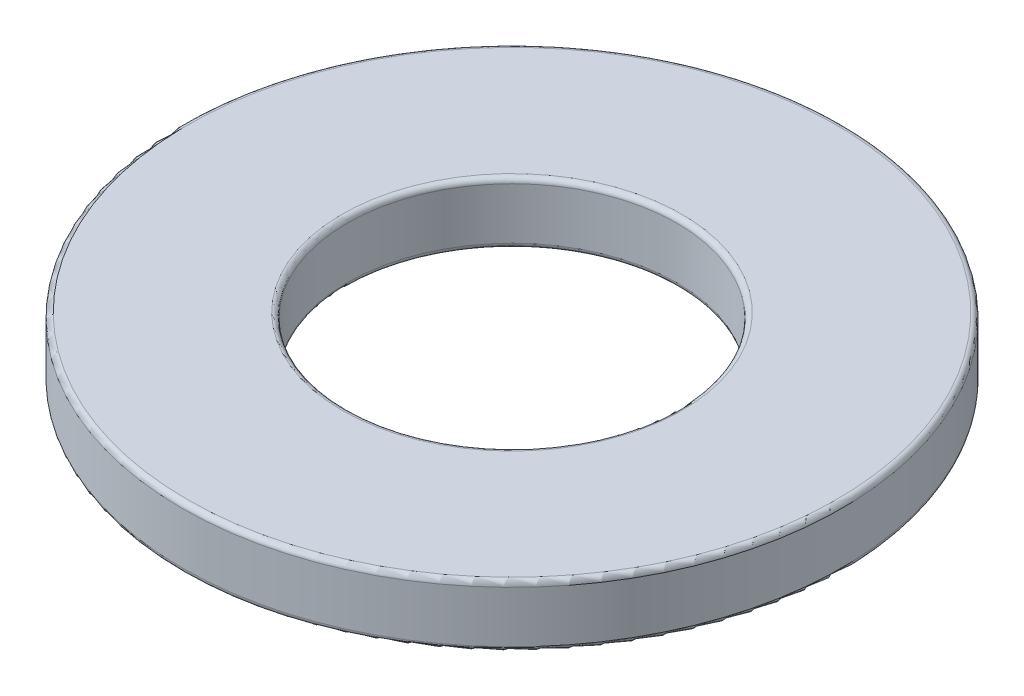
ISO-10303-21;
HEADER;
FILE_DESCRIPTION(('STEP AP214'),'2;1');
FILE_NAME('part.step','',(''),(''),'','','');
FILE_SCHEMA(('AUTOMOTIVE_DESIGN { 1 0 10303 214 1 1 1 1 }'));
ENDSEC;
DATA;
#1=APPLICATION_CONTEXT('core data for automotive mechanical design processes');
#2=APPLICATION_PROTOCOL_DEFINITION('international standard','automotive_design',2000,#1);
#3=PRODUCT_CONTEXT('',#1,'mechanical');
#4=PRODUCT('Part','Part','',(#3));
#5=PRODUCT_RELATED_PRODUCT_CATEGORY('part','',(#4));
#6=PRODUCT_DEFINITION_FORMATION('','',#4);
#7=PRODUCT_DEFINITION_CONTEXT('part definition',#1,'design');
#8=PRODUCT_DEFINITION('design','',#6,#7);
#9=PRODUCT_DEFINITION_SHAPE('','',#8);
#10=(LENGTH_UNIT() NAMED_UNIT(*) SI_UNIT(.MILLI.,.METRE.));
#11=(NAMED_UNIT(*) PLANE_ANGLE_UNIT() SI_UNIT($,.RADIAN.));
#12=(NAMED_UNIT(*) SI_UNIT($,.STERADIAN.) SOLID_ANGLE_UNIT());
#13=UNCERTAINTY_MEASURE_WITH_UNIT(LENGTH_MEASURE(1.E-05),#10,'distance_accuracy_value','');
#14=(GEOMETRIC_REPRESENTATION_CONTEXT(3) GLOBAL_UNCERTAINTY_ASSIGNED_CONTEXT((#13)) GLOBAL_UNIT_ASSIGNED_CONTEXT((#10,
#11,#12)) REPRESENTATION_CONTEXT('',''));
#15=CARTESIAN_POINT('',(0.,0.,0.));
#16=DIRECTION('',(0.,0.,1.));
#17=DIRECTION('',(1.,0.,0.));
#18=AXIS2_PLACEMENT_3D('',#15,#16,#17);
#19=CARTESIAN_POINT('',(0.,1.25,0.));
#20=DIRECTION('',(0.,1.,0.));
#21=DIRECTION('',(0.,0.,1.));
#22=AXIS2_PLACEMENT_3D('',#19,#20,#21);
#23=TOROIDAL_SURFACE('',#22,8.25,0.25);
#24=CARTESIAN_POINT('',(0.,1.5,0.));
#25=DIRECTION('',(0.,1.,0.));
#26=DIRECTION('',(0.,0.,1.));
#27=AXIS2_PLACEMENT_3D('',#24,#25,#26);
#28=CIRCLE('',#27,8.25);
#29=CARTESIAN_POINT('',(0.,1.5,8.25));
#30=VERTEX_POINT('',#29);
#31=EDGE_CURVE('E59',#30,#30,#28,.T.);
#32=ORIENTED_EDGE('',*,*,#31,.T.);
#33=EDGE_LOOP('',(#32));
#34=FACE_BOUND('',#33,.T.);
#35=CARTESIAN_POINT('',(0.,1.25,0.));
#36=DIRECTION('',(0.,1.,0.));
#37=DIRECTION('',(0.,0.,1.));
#38=AXIS2_PLACEMENT_3D('',#35,#36,#37);
#39=CIRCLE('',#38,8.);
#40=CARTESIAN_POINT('',(0.,1.25,8.));
#41=VERTEX_POINT('',#40);
#42=EDGE_CURVE('E10',#41,#41,#39,.T.);
#43=ORIENTED_EDGE('',*,*,#42,.F.);
#44=EDGE_LOOP('',(#43));
#45=FACE_BOUND('',#44,.T.);
#46=ADVANCED_FACE('F31',(#34,#45),#23,.T.);
#47=CARTESIAN_POINT('',(0.,17.9076399754782,0.));
#48=DIRECTION('',(0.,1.,0.));
#49=DIRECTION('',(0.,0.,1.));
#50=AXIS2_PLACEMENT_3D('',#47,#48,#49);
#51=CYLINDRICAL_SURFACE('',#50,8.);
#52=ORIENTED_EDGE('',*,*,#42,.T.);
#53=EDGE_LOOP('',(#52));
#54=FACE_BOUND('',#53,.T.);
#55=CARTESIAN_POINT('',(0.,-1.25,0.));
#56=DIRECTION('',(0.,1.,0.));
#57=DIRECTION('',(0.,0.,1.));
#58=AXIS2_PLACEMENT_3D('',#55,#56,#57);
#59=CIRCLE('',#58,8.);
#60=CARTESIAN_POINT('',(0.,-1.25,8.));
#61=VERTEX_POINT('',#60);
#62=EDGE_CURVE('E37',#61,#61,#59,.T.);
#63=ORIENTED_EDGE('',*,*,#62,.F.);
#64=EDGE_LOOP('',(#63));
#65=FACE_BOUND('',#64,.T.);
#66=ADVANCED_FACE('F77',(#54,#65),#51,.F.);
#67=CARTESIAN_POINT('',(0.,-1.25,0.));
#68=DIRECTION('',(0.,1.,0.));
#69=DIRECTION('',(0.,0.,1.));
#70=AXIS2_PLACEMENT_3D('',#67,#68,#69);
#71=TOROIDAL_SURFACE('',#70,8.25,0.25);
#72=ORIENTED_EDGE('',*,*,#62,.T.);
#73=EDGE_LOOP('',(#72));
#74=FACE_BOUND('',#73,.T.);
#75=CARTESIAN_POINT('',(0.,-1.5,0.));
#76=DIRECTION('',(0.,1.,0.));
#77=DIRECTION('',(0.,0.,1.));
#78=AXIS2_PLACEMENT_3D('',#75,#76,#77);
#79=CIRCLE('',#78,8.25);
#80=CARTESIAN_POINT('',(0.,-1.5,8.25));
#81=VERTEX_POINT('',#80);
#82=EDGE_CURVE('E41',#81,#81,#79,.T.);
#83=ORIENTED_EDGE('',*,*,#82,.F.);
#84=EDGE_LOOP('',(#83));
#85=FACE_BOUND('',#84,.T.);
#86=ADVANCED_FACE('F81',(#74,#85),#71,.T.);
#87=CARTESIAN_POINT('',(0.,-1.5,15.75));
#88=DIRECTION('',(0.,-1.,0.));
#89=DIRECTION('',(0.,0.,-1.));
#90=AXIS2_PLACEMENT_3D('',#87,#88,#89);
#91=PLANE('',#90);
#92=ORIENTED_EDGE('',*,*,#82,.T.);
#93=EDGE_LOOP('',(#92));
#94=FACE_BOUND('',#93,.T.);
#95=CARTESIAN_POINT('',(0.,-1.5,0.));
#96=DIRECTION('',(0.,1.,0.));
#97=DIRECTION('',(0.,0.,1.));
#98=AXIS2_PLACEMENT_3D('',#95,#96,#97);
#99=CIRCLE('',#98,15.75);
#100=CARTESIAN_POINT('',(0.,-1.5,15.75));
#101=VERTEX_POINT('',#100);
#102=EDGE_CURVE('E45',#101,#101,#99,.T.);
#103=ORIENTED_EDGE('',*,*,#102,.F.);
#104=EDGE_LOOP('',(#103));
#105=FACE_BOUND('',#104,.T.);
#106=ADVANCED_FACE('F85',(#94,#105),#91,.T.);
#107=CARTESIAN_POINT('',(0.,-1.25,0.));
#108=DIRECTION('',(0.,1.,0.));
#109=DIRECTION('',(0.,0.,1.));
#110=AXIS2_PLACEMENT_3D('',#107,#108,#109);
#111=TOROIDAL_SURFACE('',#110,15.75,0.25);
#112=ORIENTED_EDGE('',*,*,#102,.T.);
#113=EDGE_LOOP('',(#112));
#114=FACE_BOUND('',#113,.T.);
#115=CARTESIAN_POINT('',(0.,-1.25,0.));
#116=DIRECTION('',(0.,1.,0.));
#117=DIRECTION('',(0.,0.,1.));
#118=AXIS2_PLACEMENT_3D('',#115,#116,#117);
#119=CIRCLE('',#118,16.);
#120=CARTESIAN_POINT('',(0.,-1.25,16.));
#121=VERTEX_POINT('',#120);
#122=EDGE_CURVE('E50',#121,#121,#119,.T.);
#123=ORIENTED_EDGE('',*,*,#122,.F.);
#124=EDGE_LOOP('',(#123));
#125=FACE_BOUND('',#124,.T.);
#126=ADVANCED_FACE('F91',(#114,#125),#111,.T.);
#127=CARTESIAN_POINT('',(0.,17.9076399754782,0.));
#128=DIRECTION('',(0.,1.,0.));
#129=DIRECTION('',(0.,0.,1.));
#130=AXIS2_PLACEMENT_3D('',#127,#128,#129);
#131=CYLINDRICAL_SURFACE('',#130,16.);
#132=ORIENTED_EDGE('',*,*,#122,.T.);
#133=EDGE_LOOP('',(#132));
#134=FACE_BOUND('',#133,.T.);
#135=CARTESIAN_POINT('',(0.,1.25,0.));
#136=DIRECTION('',(0.,1.,0.));
#137=DIRECTION('',(0.,0.,1.));
#138=AXIS2_PLACEMENT_3D('',#135,#136,#137);
#139=CIRCLE('',#138,16.);
#140=CARTESIAN_POINT('',(0.,1.25,16.));
#141=VERTEX_POINT('',#140);
#142=EDGE_CURVE('E53',#141,#141,#139,.T.);
#143=ORIENTED_EDGE('',*,*,#142,.F.);
#144=EDGE_LOOP('',(#143));
#145=FACE_BOUND('',#144,.T.);
#146=ADVANCED_FACE('F73',(#134,#145),#131,.T.);
#147=CARTESIAN_POINT('',(0.,1.25,0.));
#148=DIRECTION('',(0.,1.,0.));
#149=DIRECTION('',(0.,0.,1.));
#150=AXIS2_PLACEMENT_3D('',#147,#148,#149);
#151=TOROIDAL_SURFACE('',#150,15.75,0.25);
#152=ORIENTED_EDGE('',*,*,#142,.T.);
#153=EDGE_LOOP('',(#152));
#154=FACE_BOUND('',#153,.T.);
#155=CARTESIAN_POINT('',(0.,1.5,0.));
#156=DIRECTION('',(0.,1.,0.));
#157=DIRECTION('',(0.,0.,1.));
#158=AXIS2_PLACEMENT_3D('',#155,#156,#157);
#159=CIRCLE('',#158,15.75);
#160=CARTESIAN_POINT('',(0.,1.5,15.75));
#161=VERTEX_POINT('',#160);
#162=EDGE_CURVE('E56',#161,#161,#159,.T.);
#163=ORIENTED_EDGE('',*,*,#162,.F.);
#164=EDGE_LOOP('',(#163));
#165=FACE_BOUND('',#164,.T.);
#166=ADVANCED_FACE('F67',(#154,#165),#151,.T.);
#167=CARTESIAN_POINT('',(0.,1.5,15.75));
#168=DIRECTION('',(0.,1.,0.));
#169=DIRECTION('',(0.,0.,1.));
#170=AXIS2_PLACEMENT_3D('',#167,#168,#169);
#171=PLANE('',#170);
#172=ORIENTED_EDGE('',*,*,#162,.T.);
#173=EDGE_LOOP('',(#172));
#174=FACE_BOUND('',#173,.T.);
#175=ORIENTED_EDGE('',*,*,#31,.F.);
#176=EDGE_LOOP('',(#175));
#177=FACE_BOUND('',#176,.T.);
#178=ADVANCED_FACE('F65',(#174,#177),#171,.T.);
#179=CLOSED_SHELL('',(#46,#66,#86,#106,#126,#146,#166,#178));
#180=MANIFOLD_SOLID_BREP('B2',#179);
#181=ADVANCED_BREP_SHAPE_REPRESENTATION('',(#18,#180),#14);
#182=SHAPE_DEFINITION_REPRESENTATION(#9,#181);
ENDSEC;
END-ISO-10303-21;
